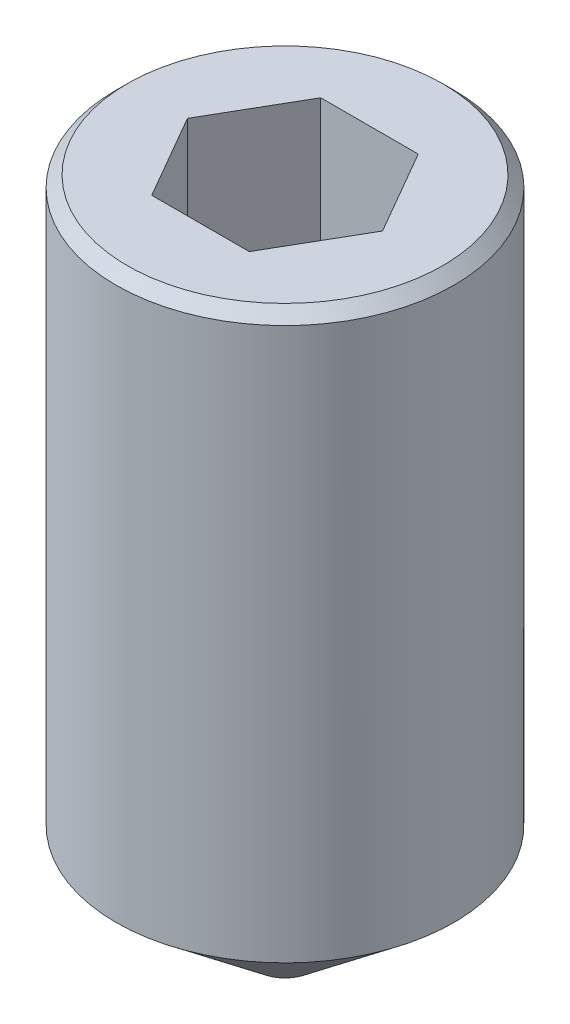
ISO-10303-21;
HEADER;
FILE_DESCRIPTION(('STEP AP214'),'2;1');
FILE_NAME('part.step','',(''),(''),'','','');
FILE_SCHEMA(('AUTOMOTIVE_DESIGN { 1 0 10303 214 1 1 1 1 }'));
ENDSEC;
DATA;
#1=APPLICATION_CONTEXT('core data for automotive mechanical design processes');
#2=APPLICATION_PROTOCOL_DEFINITION('international standard','automotive_design',2000,#1);
#3=PRODUCT_CONTEXT('',#1,'mechanical');
#4=PRODUCT('Part','Part','',(#3));
#5=PRODUCT_RELATED_PRODUCT_CATEGORY('part','',(#4));
#6=PRODUCT_DEFINITION_FORMATION('','',#4);
#7=PRODUCT_DEFINITION_CONTEXT('part definition',#1,'design');
#8=PRODUCT_DEFINITION('design','',#6,#7);
#9=PRODUCT_DEFINITION_SHAPE('','',#8);
#10=(LENGTH_UNIT() NAMED_UNIT(*) SI_UNIT(.MILLI.,.METRE.));
#11=(NAMED_UNIT(*) PLANE_ANGLE_UNIT() SI_UNIT($,.RADIAN.));
#12=(NAMED_UNIT(*) SI_UNIT($,.STERADIAN.) SOLID_ANGLE_UNIT());
#13=UNCERTAINTY_MEASURE_WITH_UNIT(LENGTH_MEASURE(1.E-05),#10,'distance_accuracy_value','');
#14=(GEOMETRIC_REPRESENTATION_CONTEXT(3) GLOBAL_UNCERTAINTY_ASSIGNED_CONTEXT((#13)) GLOBAL_UNIT_ASSIGNED_CONTEXT((#10,
#11,#12)) REPRESENTATION_CONTEXT('',''));
#15=CARTESIAN_POINT('',(0.,0.,0.));
#16=DIRECTION('',(0.,0.,1.));
#17=DIRECTION('',(1.,0.,0.));
#18=AXIS2_PLACEMENT_3D('',#15,#16,#17);
#19=CARTESIAN_POINT('',(0.,0.,0.));
#20=DIRECTION('',(0.,-1.,0.));
#21=DIRECTION('',(0.,0.,-1.));
#22=AXIS2_PLACEMENT_3D('',#19,#20,#21);
#23=PLANE('',#22);
#24=CARTESIAN_POINT('',(0.,0.,0.));
#25=DIRECTION('',(0.,-1.,0.));
#26=DIRECTION('',(0.,0.,-1.));
#27=AXIS2_PLACEMENT_3D('',#24,#25,#26);
#28=CIRCLE('',#27,1.4);
#29=CARTESIAN_POINT('',(0.,0.,-1.4));
#30=VERTEX_POINT('',#29);
#31=EDGE_CURVE('E43',#30,#30,#28,.F.);
#32=ORIENTED_EDGE('',*,*,#31,.T.);
#33=EDGE_LOOP('',(#32));
#34=FACE_BOUND('',#33,.T.);
#35=DIRECTION('',(1.,0.,0.));
#36=VECTOR('',#35,1.);
#37=CARTESIAN_POINT('',(-0.433012701892219,0.,0.75));
#38=LINE('',#37,#36);
#39=CARTESIAN_POINT('',(-0.433012701892219,0.,0.75));
#40=VERTEX_POINT('',#39);
#41=CARTESIAN_POINT('',(0.433012701892219,0.,0.75));
#42=VERTEX_POINT('',#41);
#43=EDGE_CURVE('E124',#40,#42,#38,.T.);
#44=ORIENTED_EDGE('',*,*,#43,.F.);
#45=DIRECTION('',(0.5,0.,0.866025403784438));
#46=VECTOR('',#45,1.);
#47=CARTESIAN_POINT('',(-0.866025403784439,0.,0.));
#48=LINE('',#47,#46);
#49=CARTESIAN_POINT('',(-0.866025403784439,0.,0.));
#50=VERTEX_POINT('',#49);
#51=EDGE_CURVE('E50',#50,#40,#48,.T.);
#52=ORIENTED_EDGE('',*,*,#51,.F.);
#53=DIRECTION('',(-0.5,0.,0.866025403784439));
#54=VECTOR('',#53,1.);
#55=CARTESIAN_POINT('',(-0.433012701892219,0.,-0.75));
#56=LINE('',#55,#54);
#57=CARTESIAN_POINT('',(-0.433012701892219,0.,-0.75));
#58=VERTEX_POINT('',#57);
#59=EDGE_CURVE('E133',#58,#50,#56,.T.);
#60=ORIENTED_EDGE('',*,*,#59,.F.);
#61=DIRECTION('',(-1.,0.,0.));
#62=VECTOR('',#61,1.);
#63=CARTESIAN_POINT('',(0.433012701892219,0.,-0.75));
#64=LINE('',#63,#62);
#65=CARTESIAN_POINT('',(0.433012701892219,0.,-0.75));
#66=VERTEX_POINT('',#65);
#67=EDGE_CURVE('E131',#66,#58,#64,.T.);
#68=ORIENTED_EDGE('',*,*,#67,.F.);
#69=DIRECTION('',(-0.5,0.,-0.866025403784439));
#70=VECTOR('',#69,1.);
#71=CARTESIAN_POINT('',(0.866025403784438,0.,0.));
#72=LINE('',#71,#70);
#73=CARTESIAN_POINT('',(0.866025403784438,0.,0.));
#74=VERTEX_POINT('',#73);
#75=EDGE_CURVE('E98',#74,#66,#72,.T.);
#76=ORIENTED_EDGE('',*,*,#75,.F.);
#77=DIRECTION('',(0.5,0.,-0.866025403784439));
#78=VECTOR('',#77,1.);
#79=CARTESIAN_POINT('',(0.433012701892219,0.,0.75));
#80=LINE('',#79,#78);
#81=EDGE_CURVE('E127',#42,#74,#80,.T.);
#82=ORIENTED_EDGE('',*,*,#81,.F.);
#83=EDGE_LOOP('',(#44,#52,#60,#68,#76,#82));
#84=FACE_BOUND('',#83,.T.);
#85=ADVANCED_FACE('F35',(#34,#84),#23,.F.);
#86=CARTESIAN_POINT('',(0.,8.71350028878554,0.));
#87=DIRECTION('',(0.,1.,0.));
#88=DIRECTION('',(0.,0.,1.));
#89=AXIS2_PLACEMENT_3D('',#86,#87,#88);
#90=CYLINDRICAL_SURFACE('',#89,1.5);
#91=CARTESIAN_POINT('',(0.,-0.100000000000003,0.));
#92=DIRECTION('',(0.,-1.,0.));
#93=DIRECTION('',(0.,0.,-1.));
#94=AXIS2_PLACEMENT_3D('',#91,#92,#93);
#95=CIRCLE('',#94,1.5);
#96=CARTESIAN_POINT('',(0.,-0.100000000000003,-1.5));
#97=VERTEX_POINT('',#96);
#98=EDGE_CURVE('E11',#97,#97,#95,.T.);
#99=ORIENTED_EDGE('',*,*,#98,.T.);
#100=EDGE_LOOP('',(#99));
#101=FACE_BOUND('',#100,.T.);
#102=CARTESIAN_POINT('',(0.,-5.,0.));
#103=DIRECTION('',(0.,1.,0.));
#104=DIRECTION('',(0.,0.,1.));
#105=AXIS2_PLACEMENT_3D('',#102,#103,#104);
#106=CIRCLE('',#105,1.5);
#107=CARTESIAN_POINT('',(0.,-5.,1.5));
#108=VERTEX_POINT('',#107);
#109=EDGE_CURVE('E145',#108,#108,#106,.T.);
#110=ORIENTED_EDGE('',*,*,#109,.T.);
#111=EDGE_LOOP('',(#110));
#112=FACE_BOUND('',#111,.T.);
#113=ADVANCED_FACE('F161',(#101,#112),#90,.T.);
#114=CARTESIAN_POINT('',(0.,-6.,0.));
#115=DIRECTION('',(0.,1.,0.));
#116=DIRECTION('',(0.,0.,1.));
#117=AXIS2_PLACEMENT_3D('',#114,#115,#116);
#118=CONICAL_SURFACE('',#117,0.250000000000002,0.896055384571344);
#119=CARTESIAN_POINT('',(0.,-6.,0.));
#120=DIRECTION('',(0.,1.,0.));
#121=DIRECTION('',(0.,0.,1.));
#122=AXIS2_PLACEMENT_3D('',#119,#120,#121);
#123=CIRCLE('',#122,0.250000000000002);
#124=CARTESIAN_POINT('',(0.,-6.,0.250000000000001));
#125=VERTEX_POINT('',#124);
#126=EDGE_CURVE('E137',#125,#125,#123,.T.);
#127=CARTESIAN_POINT('',(0.,-5.,1.5));
#128=CARTESIAN_POINT('',(0.,-5.01041666666667,1.48697916666667));
#129=CARTESIAN_POINT('',(0.,-5.02083333333333,1.47395833333333));
#130=CARTESIAN_POINT('',(0.,-5.04166666666667,1.44791666666667));
#131=CARTESIAN_POINT('',(0.,-5.05208333333333,1.43489583333333));
#132=CARTESIAN_POINT('',(0.,-5.07291666666667,1.40885416666667));
#133=CARTESIAN_POINT('',(0.,-5.08333333333333,1.39583333333333));
#134=CARTESIAN_POINT('',(0.,-5.10416666666667,1.36979166666667));
#135=CARTESIAN_POINT('',(0.,-5.11458333333333,1.35677083333333));
#136=CARTESIAN_POINT('',(0.,-5.13541666666667,1.33072916666667));
#137=CARTESIAN_POINT('',(0.,-5.14583333333333,1.31770833333333));
#138=CARTESIAN_POINT('',(0.,-5.16666666666667,1.29166666666667));
#139=CARTESIAN_POINT('',(0.,-5.17708333333333,1.27864583333333));
#140=CARTESIAN_POINT('',(0.,-5.19791666666667,1.25260416666667));
#141=CARTESIAN_POINT('',(0.,-5.20833333333333,1.23958333333333));
#142=CARTESIAN_POINT('',(0.,-5.22916666666667,1.21354166666667));
#143=CARTESIAN_POINT('',(0.,-5.23958333333333,1.20052083333333));
#144=CARTESIAN_POINT('',(0.,-5.26041666666667,1.17447916666667));
#145=CARTESIAN_POINT('',(0.,-5.27083333333333,1.16145833333333));
#146=CARTESIAN_POINT('',(0.,-5.29166666666667,1.13541666666667));
#147=CARTESIAN_POINT('',(0.,-5.30208333333333,1.12239583333333));
#148=CARTESIAN_POINT('',(0.,-5.32291666666667,1.09635416666667));
#149=CARTESIAN_POINT('',(0.,-5.33333333333333,1.08333333333333));
#150=CARTESIAN_POINT('',(0.,-5.35416666666667,1.05729166666667));
#151=CARTESIAN_POINT('',(0.,-5.36458333333333,1.04427083333333));
#152=CARTESIAN_POINT('',(0.,-5.38541666666667,1.01822916666667));
#153=CARTESIAN_POINT('',(0.,-5.39583333333333,1.00520833333333));
#154=CARTESIAN_POINT('',(0.,-5.41666666666667,0.979166666666668));
#155=CARTESIAN_POINT('',(0.,-5.42708333333333,0.966145833333334));
#156=CARTESIAN_POINT('',(0.,-5.44791666666667,0.940104166666668));
#157=CARTESIAN_POINT('',(0.,-5.45833333333333,0.927083333333334));
#158=CARTESIAN_POINT('',(0.,-5.47916666666667,0.901041666666668));
#159=CARTESIAN_POINT('',(0.,-5.48958333333333,0.888020833333334));
#160=CARTESIAN_POINT('',(0.,-5.51041666666667,0.861979166666668));
#161=CARTESIAN_POINT('',(0.,-5.52083333333333,0.848958333333334));
#162=CARTESIAN_POINT('',(0.,-5.54166666666667,0.822916666666668));
#163=CARTESIAN_POINT('',(0.,-5.55208333333333,0.809895833333334));
#164=CARTESIAN_POINT('',(0.,-5.57291666666667,0.783854166666668));
#165=CARTESIAN_POINT('',(0.,-5.58333333333333,0.770833333333334));
#166=CARTESIAN_POINT('',(0.,-5.60416666666667,0.744791666666668));
#167=CARTESIAN_POINT('',(0.,-5.61458333333333,0.731770833333334));
#168=CARTESIAN_POINT('',(0.,-5.63541666666667,0.705729166666668));
#169=CARTESIAN_POINT('',(0.,-5.64583333333333,0.692708333333334));
#170=CARTESIAN_POINT('',(0.,-5.66666666666667,0.666666666666668));
#171=CARTESIAN_POINT('',(0.,-5.67708333333333,0.653645833333334));
#172=CARTESIAN_POINT('',(0.,-5.69791666666667,0.627604166666668));
#173=CARTESIAN_POINT('',(0.,-5.70833333333333,0.614583333333334));
#174=CARTESIAN_POINT('',(0.,-5.72916666666667,0.588541666666668));
#175=CARTESIAN_POINT('',(0.,-5.73958333333333,0.575520833333334));
#176=CARTESIAN_POINT('',(0.,-5.76041666666667,0.549479166666668));
#177=CARTESIAN_POINT('',(0.,-5.77083333333333,0.536458333333334));
#178=CARTESIAN_POINT('',(0.,-5.79166666666667,0.510416666666668));
#179=CARTESIAN_POINT('',(0.,-5.80208333333333,0.497395833333334));
#180=CARTESIAN_POINT('',(0.,-5.82291666666667,0.471354166666668));
#181=CARTESIAN_POINT('',(0.,-5.83333333333333,0.458333333333335));
#182=CARTESIAN_POINT('',(0.,-5.85416666666667,0.432291666666668));
#183=CARTESIAN_POINT('',(0.,-5.86458333333333,0.419270833333335));
#184=CARTESIAN_POINT('',(0.,-5.88541666666667,0.393229166666668));
#185=CARTESIAN_POINT('',(0.,-5.89583333333333,0.380208333333334));
#186=CARTESIAN_POINT('',(0.,-5.91666666666667,0.354166666666668));
#187=CARTESIAN_POINT('',(0.,-5.92708333333333,0.341145833333335));
#188=CARTESIAN_POINT('',(0.,-5.94791666666667,0.315104166666668));
#189=CARTESIAN_POINT('',(0.,-5.95833333333333,0.302083333333335));
#190=CARTESIAN_POINT('',(0.,-5.97916666666667,0.276041666666668));
#191=CARTESIAN_POINT('',(0.,-5.98958333333333,0.263020833333334));
#192=CARTESIAN_POINT('',(0.,-6.,0.250000000000001));
#193=B_SPLINE_CURVE_WITH_KNOTS('',3,(#127,#128,#129,#130,#131,#132,#133,#134,#135,#136,#137,
#138,#139,#140,#141,#142,#143,#144,#145,#146,#147,#148,#149,#150,#151,#152,#153,#154,#155,#156,
#157,#158,#159,#160,#161,#162,#163,#164,#165,#166,#167,#168,#169,#170,#171,#172,#173,#174,#175,
#176,#177,#178,#179,#180,#181,#182,#183,#184,#185,#186,#187,#188,#189,#190,#191,#192),
.UNSPECIFIED.,.F.,.F.,(4,2,2,2,2,2,2,2,2,2,2,2,2,2,2,2,2,2,2,2,2,2,2,2,2,2,2,2,2,2,2,2,4),(0.,
0.0500244081049443,0.100048816209888,0.150073224314832,0.200097632419777,0.250122040524721,
0.300146448629665,0.350170856734609,0.400195264839553,0.450219672944497,0.500244081049441,
0.550268489154385,0.60029289725933,0.650317305364274,0.700341713469218,0.750366121574162,
0.800390529679106,0.850414937784051,0.900439345888994,0.950463753993938,1.00048816209888,
1.05051257020383,1.10053697830877,1.15056138641371,1.20058579451866,1.2506102026236,
1.30063461072855,1.35065901883349,1.40068342693844,1.45070783504338,1.50073224314832,
1.55075665125327,1.60078105935821),.UNSPECIFIED.);
#194=EDGE_CURVE('BSEAM165',#108,#125,#193,.T.);
#195=ORIENTED_EDGE('',*,*,#109,.F.);
#196=ORIENTED_EDGE('',*,*,#126,.T.);
#197=ORIENTED_EDGE('',*,*,#194,.T.);
#198=ORIENTED_EDGE('',*,*,#194,.F.);
#199=EDGE_LOOP('',(#195,#197,#196,#198));
#200=FACE_BOUND('',#199,.T.);
#201=ADVANCED_FACE('F165',(#200),#118,.T.);
#202=CARTESIAN_POINT('',(0.250000000000002,-6.,0.));
#203=DIRECTION('',(0.,1.,0.));
#204=DIRECTION('',(0.,0.,1.));
#205=AXIS2_PLACEMENT_3D('',#202,#203,#204);
#206=PLANE('',#205);
#207=ORIENTED_EDGE('',*,*,#126,.F.);
#208=EDGE_LOOP('',(#207));
#209=FACE_BOUND('',#208,.T.);
#210=ADVANCED_FACE('F171',(#209),#206,.F.);
#211=CARTESIAN_POINT('',(-0.866025403784439,-1.5,0.));
#212=DIRECTION('',(-0.866025403784438,0.,0.5));
#213=DIRECTION('',(0.5,0.,0.866025403784438));
#214=AXIS2_PLACEMENT_3D('',#211,#212,#213);
#215=PLANE('',#214);
#216=ORIENTED_EDGE('',*,*,#51,.T.);
#217=DIRECTION('',(0.,1.,0.));
#218=VECTOR('',#217,1.);
#219=CARTESIAN_POINT('',(-0.433012701892219,-1.5,0.75));
#220=LINE('',#219,#218);
#221=CARTESIAN_POINT('',(-0.433012701892219,-1.5,0.75));
#222=VERTEX_POINT('',#221);
#223=EDGE_CURVE('E80',#222,#40,#220,.T.);
#224=ORIENTED_EDGE('',*,*,#223,.F.);
#225=DIRECTION('',(0.5,0.,0.866025403784438));
#226=VECTOR('',#225,1.);
#227=CARTESIAN_POINT('',(-0.866025403784439,-1.5,0.));
#228=LINE('',#227,#226);
#229=CARTESIAN_POINT('',(-0.866025403784439,-1.5,0.));
#230=VERTEX_POINT('',#229);
#231=EDGE_CURVE('E135',#230,#222,#228,.T.);
#232=ORIENTED_EDGE('',*,*,#231,.F.);
#233=DIRECTION('',(0.,1.,0.));
#234=VECTOR('',#233,1.);
#235=CARTESIAN_POINT('',(-0.866025403784439,-1.5,0.));
#236=LINE('',#235,#234);
#237=EDGE_CURVE('E58',#230,#50,#236,.T.);
#238=ORIENTED_EDGE('',*,*,#237,.T.);
#239=EDGE_LOOP('',(#216,#224,#232,#238));
#240=FACE_BOUND('',#239,.T.);
#241=ADVANCED_FACE('F175',(#240),#215,.F.);
#242=CARTESIAN_POINT('',(-0.433012701892219,-1.5,-0.75));
#243=DIRECTION('',(-0.866025403784439,0.,-0.5));
#244=DIRECTION('',(-0.5,0.,0.866025403784439));
#245=AXIS2_PLACEMENT_3D('',#242,#243,#244);
#246=PLANE('',#245);
#247=ORIENTED_EDGE('',*,*,#59,.T.);
#248=ORIENTED_EDGE('',*,*,#237,.F.);
#249=DIRECTION('',(-0.5,0.,0.866025403784439));
#250=VECTOR('',#249,1.);
#251=CARTESIAN_POINT('',(-0.433012701892219,-1.5,-0.75));
#252=LINE('',#251,#250);
#253=CARTESIAN_POINT('',(-0.433012701892219,-1.5,-0.75));
#254=VERTEX_POINT('',#253);
#255=EDGE_CURVE('E110',#254,#230,#252,.T.);
#256=ORIENTED_EDGE('',*,*,#255,.F.);
#257=DIRECTION('',(0.,1.,0.));
#258=VECTOR('',#257,1.);
#259=CARTESIAN_POINT('',(-0.433012701892219,-1.5,-0.75));
#260=LINE('',#259,#258);
#261=EDGE_CURVE('E102',#254,#58,#260,.T.);
#262=ORIENTED_EDGE('',*,*,#261,.T.);
#263=EDGE_LOOP('',(#247,#248,#256,#262));
#264=FACE_BOUND('',#263,.T.);
#265=ADVANCED_FACE('F179',(#264),#246,.F.);
#266=CARTESIAN_POINT('',(0.433012701892219,-1.5,-0.75));
#267=DIRECTION('',(0.,0.,-1.));
#268=DIRECTION('',(-1.,0.,0.));
#269=AXIS2_PLACEMENT_3D('',#266,#267,#268);
#270=PLANE('',#269);
#271=ORIENTED_EDGE('',*,*,#67,.T.);
#272=ORIENTED_EDGE('',*,*,#261,.F.);
#273=DIRECTION('',(-1.,0.,0.));
#274=VECTOR('',#273,1.);
#275=CARTESIAN_POINT('',(0.433012701892219,-1.5,-0.75));
#276=LINE('',#275,#274);
#277=CARTESIAN_POINT('',(0.433012701892219,-1.5,-0.75));
#278=VERTEX_POINT('',#277);
#279=EDGE_CURVE('E106',#278,#254,#276,.T.);
#280=ORIENTED_EDGE('',*,*,#279,.F.);
#281=DIRECTION('',(0.,1.,0.));
#282=VECTOR('',#281,1.);
#283=CARTESIAN_POINT('',(0.433012701892219,-1.5,-0.75));
#284=LINE('',#283,#282);
#285=EDGE_CURVE('E91',#278,#66,#284,.T.);
#286=ORIENTED_EDGE('',*,*,#285,.T.);
#287=EDGE_LOOP('',(#271,#272,#280,#286));
#288=FACE_BOUND('',#287,.T.);
#289=ADVANCED_FACE('F107',(#288),#270,.F.);
#290=CARTESIAN_POINT('',(0.866025403784438,-1.5,0.));
#291=DIRECTION('',(0.866025403784438,0.,-0.5));
#292=DIRECTION('',(-0.5,0.,-0.866025403784439));
#293=AXIS2_PLACEMENT_3D('',#290,#291,#292);
#294=PLANE('',#293);
#295=ORIENTED_EDGE('',*,*,#75,.T.);
#296=ORIENTED_EDGE('',*,*,#285,.F.);
#297=DIRECTION('',(-0.5,0.,-0.866025403784439));
#298=VECTOR('',#297,1.);
#299=CARTESIAN_POINT('',(0.866025403784438,-1.5,0.));
#300=LINE('',#299,#298);
#301=CARTESIAN_POINT('',(0.866025403784438,-1.5,0.));
#302=VERTEX_POINT('',#301);
#303=EDGE_CURVE('E95',#302,#278,#300,.T.);
#304=ORIENTED_EDGE('',*,*,#303,.F.);
#305=DIRECTION('',(0.,1.,0.));
#306=VECTOR('',#305,1.);
#307=CARTESIAN_POINT('',(0.866025403784438,-1.5,0.));
#308=LINE('',#307,#306);
#309=EDGE_CURVE('E103',#302,#74,#308,.T.);
#310=ORIENTED_EDGE('',*,*,#309,.T.);
#311=EDGE_LOOP('',(#295,#296,#304,#310));
#312=FACE_BOUND('',#311,.T.);
#313=ADVANCED_FACE('F93',(#312),#294,.F.);
#314=CARTESIAN_POINT('',(0.433012701892219,-1.5,0.75));
#315=DIRECTION('',(0.866025403784439,0.,0.5));
#316=DIRECTION('',(0.5,0.,-0.866025403784439));
#317=AXIS2_PLACEMENT_3D('',#314,#315,#316);
#318=PLANE('',#317);
#319=ORIENTED_EDGE('',*,*,#81,.T.);
#320=ORIENTED_EDGE('',*,*,#309,.F.);
#321=DIRECTION('',(0.5,0.,-0.866025403784439));
#322=VECTOR('',#321,1.);
#323=CARTESIAN_POINT('',(0.433012701892219,-1.5,0.75));
#324=LINE('',#323,#322);
#325=CARTESIAN_POINT('',(0.433012701892219,-1.5,0.75));
#326=VERTEX_POINT('',#325);
#327=EDGE_CURVE('E116',#326,#302,#324,.T.);
#328=ORIENTED_EDGE('',*,*,#327,.F.);
#329=DIRECTION('',(0.,1.,0.));
#330=VECTOR('',#329,1.);
#331=CARTESIAN_POINT('',(0.433012701892219,-1.5,0.75));
#332=LINE('',#331,#330);
#333=EDGE_CURVE('E140',#326,#42,#332,.T.);
#334=ORIENTED_EDGE('',*,*,#333,.T.);
#335=EDGE_LOOP('',(#319,#320,#328,#334));
#336=FACE_BOUND('',#335,.T.);
#337=ADVANCED_FACE('F182',(#336),#318,.F.);
#338=CARTESIAN_POINT('',(-0.433012701892219,-1.5,0.75));
#339=DIRECTION('',(0.,0.,1.));
#340=DIRECTION('',(1.,0.,0.));
#341=AXIS2_PLACEMENT_3D('',#338,#339,#340);
#342=PLANE('',#341);
#343=ORIENTED_EDGE('',*,*,#43,.T.);
#344=ORIENTED_EDGE('',*,*,#333,.F.);
#345=DIRECTION('',(1.,0.,0.));
#346=VECTOR('',#345,1.);
#347=CARTESIAN_POINT('',(-0.433012701892219,-1.5,0.75));
#348=LINE('',#347,#346);
#349=EDGE_CURVE('E118',#222,#326,#348,.T.);
#350=ORIENTED_EDGE('',*,*,#349,.F.);
#351=ORIENTED_EDGE('',*,*,#223,.T.);
#352=EDGE_LOOP('',(#343,#344,#350,#351));
#353=FACE_BOUND('',#352,.T.);
#354=ADVANCED_FACE('F157',(#353),#342,.F.);
#355=CARTESIAN_POINT('',(0.,-1.5,0.));
#356=DIRECTION('',(0.,1.,0.));
#357=DIRECTION('',(0.,0.,1.));
#358=AXIS2_PLACEMENT_3D('',#355,#356,#357);
#359=PLANE('',#358);
#360=ORIENTED_EDGE('',*,*,#231,.T.);
#361=ORIENTED_EDGE('',*,*,#349,.T.);
#362=ORIENTED_EDGE('',*,*,#327,.T.);
#363=ORIENTED_EDGE('',*,*,#303,.T.);
#364=ORIENTED_EDGE('',*,*,#279,.T.);
#365=ORIENTED_EDGE('',*,*,#255,.T.);
#366=EDGE_LOOP('',(#360,#361,#362,#363,#364,#365));
#367=FACE_BOUND('',#366,.T.);
#368=ADVANCED_FACE('F113',(#367),#359,.T.);
#369=CARTESIAN_POINT('',(0.,0.,0.));
#370=DIRECTION('',(0.,-1.,0.));
#371=DIRECTION('',(0.,0.,-1.));
#372=AXIS2_PLACEMENT_3D('',#369,#370,#371);
#373=CONICAL_SURFACE('',#372,1.4,0.785398163397446);
#374=ORIENTED_EDGE('',*,*,#98,.F.);
#375=EDGE_LOOP('',(#374));
#376=FACE_BOUND('',#375,.T.);
#377=ORIENTED_EDGE('',*,*,#31,.F.);
#378=EDGE_LOOP('',(#377));
#379=FACE_BOUND('',#378,.T.);
#380=ADVANCED_FACE('F37',(#376,#379),#373,.T.);
#381=CLOSED_SHELL('',(#85,#113,#201,#210,#241,#265,#289,#313,#337,#354,#368,#380));
#382=MANIFOLD_SOLID_BREP('B2',#381);
#383=ADVANCED_BREP_SHAPE_REPRESENTATION('',(#18,#382),#14);
#384=SHAPE_DEFINITION_REPRESENTATION(#9,#383);
ENDSEC;
END-ISO-10303-21;
